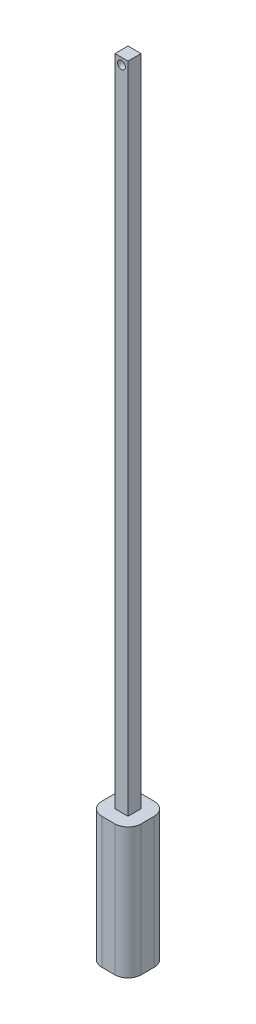
ISO-10303-21;
HEADER;
FILE_DESCRIPTION(('STEP AP214'),'2;1');
FILE_NAME('part.step','',(''),(''),'','','');
FILE_SCHEMA(('AUTOMOTIVE_DESIGN { 1 0 10303 214 1 1 1 1 }'));
ENDSEC;
DATA;
#1=APPLICATION_CONTEXT('core data for automotive mechanical design processes');
#2=APPLICATION_PROTOCOL_DEFINITION('international standard','automotive_design',2000,#1);
#3=PRODUCT_CONTEXT('',#1,'mechanical');
#4=PRODUCT('Part','Part','',(#3));
#5=PRODUCT_RELATED_PRODUCT_CATEGORY('part','',(#4));
#6=PRODUCT_DEFINITION_FORMATION('','',#4);
#7=PRODUCT_DEFINITION_CONTEXT('part definition',#1,'design');
#8=PRODUCT_DEFINITION('design','',#6,#7);
#9=PRODUCT_DEFINITION_SHAPE('','',#8);
#10=(LENGTH_UNIT() NAMED_UNIT(*) SI_UNIT(.MILLI.,.METRE.));
#11=(NAMED_UNIT(*) PLANE_ANGLE_UNIT() SI_UNIT($,.RADIAN.));
#12=(NAMED_UNIT(*) SI_UNIT($,.STERADIAN.) SOLID_ANGLE_UNIT());
#13=UNCERTAINTY_MEASURE_WITH_UNIT(LENGTH_MEASURE(1.E-05),#10,'distance_accuracy_value','');
#14=(GEOMETRIC_REPRESENTATION_CONTEXT(3) GLOBAL_UNCERTAINTY_ASSIGNED_CONTEXT((#13)) GLOBAL_UNIT_ASSIGNED_CONTEXT((#10,
#11,#12)) REPRESENTATION_CONTEXT('',''));
#15=CARTESIAN_POINT('',(0.,0.,0.));
#16=DIRECTION('',(0.,0.,1.));
#17=DIRECTION('',(1.,0.,0.));
#18=AXIS2_PLACEMENT_3D('',#15,#16,#17);
#19=CARTESIAN_POINT('',(0.,0.,10.));
#20=DIRECTION('',(0.,0.,1.));
#21=DIRECTION('',(1.,0.,0.));
#22=AXIS2_PLACEMENT_3D('',#19,#20,#21);
#23=PLANE('',#22);
#24=DIRECTION('',(0.,-1.,0.));
#25=VECTOR('',#24,1.);
#26=CARTESIAN_POINT('',(-5.,5.,10.));
#27=LINE('',#26,#25);
#28=CARTESIAN_POINT('',(-5.,5.,10.));
#29=VERTEX_POINT('',#28);
#30=CARTESIAN_POINT('',(-5.,-495.,10.));
#31=VERTEX_POINT('',#30);
#32=EDGE_CURVE('E142',#29,#31,#27,.T.);
#33=ORIENTED_EDGE('',*,*,#32,.T.);
#34=DIRECTION('',(1.,0.,0.));
#35=VECTOR('',#34,1.);
#36=CARTESIAN_POINT('',(-4.99999999999994,-495.,10.));
#37=LINE('',#36,#35);
#38=CARTESIAN_POINT('',(5.00000000000006,-495.,10.));
#39=VERTEX_POINT('',#38);
#40=EDGE_CURVE('E127',#31,#39,#37,.T.);
#41=ORIENTED_EDGE('',*,*,#40,.T.);
#42=DIRECTION('',(0.,1.,0.));
#43=VECTOR('',#42,1.);
#44=CARTESIAN_POINT('',(5.,5.,10.));
#45=LINE('',#44,#43);
#46=CARTESIAN_POINT('',(5.,5.,10.));
#47=VERTEX_POINT('',#46);
#48=EDGE_CURVE('E139',#39,#47,#45,.T.);
#49=ORIENTED_EDGE('',*,*,#48,.T.);
#50=DIRECTION('',(-1.,0.,0.));
#51=VECTOR('',#50,1.);
#52=CARTESIAN_POINT('',(-5.,5.,10.));
#53=LINE('',#52,#51);
#54=EDGE_CURVE('E148',#47,#29,#53,.T.);
#55=ORIENTED_EDGE('',*,*,#54,.T.);
#56=EDGE_LOOP('',(#33,#41,#49,#55));
#57=FACE_BOUND('',#56,.T.);
#58=CARTESIAN_POINT('',(0.,0.,10.));
#59=DIRECTION('',(0.,0.,1.));
#60=DIRECTION('',(1.,0.,0.));
#61=AXIS2_PLACEMENT_3D('',#58,#59,#60);
#62=CIRCLE('',#61,3.);
#63=CARTESIAN_POINT('',(3.,0.,10.));
#64=VERTEX_POINT('',#63);
#65=EDGE_CURVE('E157',#64,#64,#62,.T.);
#66=ORIENTED_EDGE('',*,*,#65,.F.);
#67=EDGE_LOOP('',(#66));
#68=FACE_BOUND('',#67,.T.);
#69=ADVANCED_FACE('F35',(#57,#68),#23,.T.);
#70=CARTESIAN_POINT('',(0.,0.,0.));
#71=DIRECTION('',(0.,0.,1.));
#72=DIRECTION('',(1.,0.,0.));
#73=AXIS2_PLACEMENT_3D('',#70,#71,#72);
#74=PLANE('',#73);
#75=DIRECTION('',(0.,-1.,0.));
#76=VECTOR('',#75,1.);
#77=CARTESIAN_POINT('',(-5.,5.,0.));
#78=LINE('',#77,#76);
#79=CARTESIAN_POINT('',(-5.,5.,0.));
#80=VERTEX_POINT('',#79);
#81=CARTESIAN_POINT('',(-5.,-495.,0.));
#82=VERTEX_POINT('',#81);
#83=EDGE_CURVE('E154',#80,#82,#78,.T.);
#84=ORIENTED_EDGE('',*,*,#83,.F.);
#85=DIRECTION('',(-1.,0.,0.));
#86=VECTOR('',#85,1.);
#87=CARTESIAN_POINT('',(-5.,5.,0.));
#88=LINE('',#87,#86);
#89=CARTESIAN_POINT('',(5.,5.,0.));
#90=VERTEX_POINT('',#89);
#91=EDGE_CURVE('E161',#90,#80,#88,.T.);
#92=ORIENTED_EDGE('',*,*,#91,.F.);
#93=DIRECTION('',(0.,1.,0.));
#94=VECTOR('',#93,1.);
#95=CARTESIAN_POINT('',(5.,5.,0.));
#96=LINE('',#95,#94);
#97=CARTESIAN_POINT('',(5.00000000000006,-495.,0.));
#98=VERTEX_POINT('',#97);
#99=EDGE_CURVE('E159',#98,#90,#96,.T.);
#100=ORIENTED_EDGE('',*,*,#99,.F.);
#101=DIRECTION('',(1.,0.,0.));
#102=VECTOR('',#101,1.);
#103=CARTESIAN_POINT('',(-4.99999999999994,-495.,0.));
#104=LINE('',#103,#102);
#105=EDGE_CURVE('E130',#82,#98,#104,.T.);
#106=ORIENTED_EDGE('',*,*,#105,.F.);
#107=EDGE_LOOP('',(#84,#92,#100,#106));
#108=FACE_BOUND('',#107,.T.);
#109=CARTESIAN_POINT('',(0.,0.,0.));
#110=DIRECTION('',(0.,0.,1.));
#111=DIRECTION('',(1.,0.,0.));
#112=AXIS2_PLACEMENT_3D('',#109,#110,#111);
#113=CIRCLE('',#112,3.);
#114=CARTESIAN_POINT('',(3.,0.,0.));
#115=VERTEX_POINT('',#114);
#116=EDGE_CURVE('E225',#115,#115,#113,.T.);
#117=ORIENTED_EDGE('',*,*,#116,.T.);
#118=EDGE_LOOP('',(#117));
#119=FACE_BOUND('',#118,.T.);
#120=ADVANCED_FACE('F265',(#108,#119),#74,.F.);
#121=CARTESIAN_POINT('',(-5.,5.,10.));
#122=DIRECTION('',(1.,0.,0.));
#123=DIRECTION('',(0.,1.,0.));
#124=AXIS2_PLACEMENT_3D('',#121,#122,#123);
#125=PLANE('',#124);
#126=ORIENTED_EDGE('',*,*,#83,.T.);
#127=DIRECTION('',(0.,0.,-1.));
#128=VECTOR('',#127,1.);
#129=CARTESIAN_POINT('',(-4.99999999999994,-495.,10.));
#130=LINE('',#129,#128);
#131=EDGE_CURVE('E134',#31,#82,#130,.T.);
#132=ORIENTED_EDGE('',*,*,#131,.F.);
#133=ORIENTED_EDGE('',*,*,#32,.F.);
#134=DIRECTION('',(0.,0.,-1.));
#135=VECTOR('',#134,1.);
#136=CARTESIAN_POINT('',(-5.,5.,10.));
#137=LINE('',#136,#135);
#138=EDGE_CURVE('E150',#29,#80,#137,.T.);
#139=ORIENTED_EDGE('',*,*,#138,.T.);
#140=EDGE_LOOP('',(#126,#132,#133,#139));
#141=FACE_BOUND('',#140,.T.);
#142=ADVANCED_FACE('F270',(#141),#125,.F.);
#143=CARTESIAN_POINT('',(5.,5.,10.));
#144=DIRECTION('',(-1.,0.,0.));
#145=DIRECTION('',(0.,-1.,0.));
#146=AXIS2_PLACEMENT_3D('',#143,#144,#145);
#147=PLANE('',#146);
#148=ORIENTED_EDGE('',*,*,#99,.T.);
#149=DIRECTION('',(0.,0.,-1.));
#150=VECTOR('',#149,1.);
#151=CARTESIAN_POINT('',(5.,5.,10.));
#152=LINE('',#151,#150);
#153=EDGE_CURVE('E135',#47,#90,#152,.T.);
#154=ORIENTED_EDGE('',*,*,#153,.F.);
#155=ORIENTED_EDGE('',*,*,#48,.F.);
#156=DIRECTION('',(0.,0.,-1.));
#157=VECTOR('',#156,1.);
#158=CARTESIAN_POINT('',(5.00000000000006,-495.,10.));
#159=LINE('',#158,#157);
#160=EDGE_CURVE('E124',#39,#98,#159,.T.);
#161=ORIENTED_EDGE('',*,*,#160,.T.);
#162=EDGE_LOOP('',(#148,#154,#155,#161));
#163=FACE_BOUND('',#162,.T.);
#164=ADVANCED_FACE('F145',(#163),#147,.F.);
#165=CARTESIAN_POINT('',(-5.,5.,10.));
#166=DIRECTION('',(0.,-1.,0.));
#167=DIRECTION('',(0.,0.,-1.));
#168=AXIS2_PLACEMENT_3D('',#165,#166,#167);
#169=PLANE('',#168);
#170=ORIENTED_EDGE('',*,*,#91,.T.);
#171=ORIENTED_EDGE('',*,*,#138,.F.);
#172=ORIENTED_EDGE('',*,*,#54,.F.);
#173=ORIENTED_EDGE('',*,*,#153,.T.);
#174=EDGE_LOOP('',(#170,#171,#172,#173));
#175=FACE_BOUND('',#174,.T.);
#176=ADVANCED_FACE('F277',(#175),#169,.F.);
#177=CARTESIAN_POINT('',(0.,0.,10.));
#178=DIRECTION('',(0.,0.,-1.));
#179=DIRECTION('',(-1.,0.,0.));
#180=AXIS2_PLACEMENT_3D('',#177,#178,#179);
#181=CYLINDRICAL_SURFACE('',#180,3.);
#182=ORIENTED_EDGE('',*,*,#65,.T.);
#183=EDGE_LOOP('',(#182));
#184=FACE_BOUND('',#183,.T.);
#185=ORIENTED_EDGE('',*,*,#116,.F.);
#186=EDGE_LOOP('',(#185));
#187=FACE_BOUND('',#186,.T.);
#188=ADVANCED_FACE('F274',(#184,#187),#181,.F.);
#189=CARTESIAN_POINT('',(0.,-495.,0.));
#190=DIRECTION('',(0.,-1.,0.));
#191=DIRECTION('',(0.,0.,-1.));
#192=AXIS2_PLACEMENT_3D('',#189,#190,#191);
#193=PLANE('',#192);
#194=DIRECTION('',(1.,0.,0.));
#195=VECTOR('',#194,1.);
#196=CARTESIAN_POINT('',(-14.9999999999999,-495.,-10.));
#197=LINE('',#196,#195);
#198=CARTESIAN_POINT('',(-4.99999999999994,-495.,-10.));
#199=VERTEX_POINT('',#198);
#200=CARTESIAN_POINT('',(5.00000000000006,-495.,-10.));
#201=VERTEX_POINT('',#200);
#202=EDGE_CURVE('E221',#199,#201,#197,.T.);
#203=ORIENTED_EDGE('',*,*,#202,.F.);
#204=CARTESIAN_POINT('',(-4.99999999999994,-495.,0.));
#205=DIRECTION('',(0.,-1.,0.));
#206=DIRECTION('',(0.,0.,-1.));
#207=AXIS2_PLACEMENT_3D('',#204,#205,#206);
#208=CIRCLE('',#207,10.);
#209=CARTESIAN_POINT('',(-14.9999999999999,-495.,0.));
#210=VERTEX_POINT('',#209);
#211=EDGE_CURVE('E178',#199,#210,#208,.F.);
#212=ORIENTED_EDGE('',*,*,#211,.T.);
#213=DIRECTION('',(0.,0.,-1.));
#214=VECTOR('',#213,1.);
#215=CARTESIAN_POINT('',(-14.9999999999999,-495.,20.));
#216=LINE('',#215,#214);
#217=CARTESIAN_POINT('',(-14.9999999999999,-495.,10.));
#218=VERTEX_POINT('',#217);
#219=EDGE_CURVE('E213',#218,#210,#216,.T.);
#220=ORIENTED_EDGE('',*,*,#219,.F.);
#221=CARTESIAN_POINT('',(-4.99999999999994,-495.,10.));
#222=DIRECTION('',(0.,-1.,0.));
#223=DIRECTION('',(0.,0.,-1.));
#224=AXIS2_PLACEMENT_3D('',#221,#222,#223);
#225=CIRCLE('',#224,10.);
#226=CARTESIAN_POINT('',(-4.99999999999994,-495.,20.));
#227=VERTEX_POINT('',#226);
#228=EDGE_CURVE('E172',#218,#227,#225,.F.);
#229=ORIENTED_EDGE('',*,*,#228,.T.);
#230=DIRECTION('',(-1.,0.,0.));
#231=VECTOR('',#230,1.);
#232=CARTESIAN_POINT('',(-14.9999999999999,-495.,20.));
#233=LINE('',#232,#231);
#234=CARTESIAN_POINT('',(5.00000000000006,-495.,20.));
#235=VERTEX_POINT('',#234);
#236=EDGE_CURVE('E211',#235,#227,#233,.T.);
#237=ORIENTED_EDGE('',*,*,#236,.F.);
#238=CARTESIAN_POINT('',(5.00000000000006,-495.,10.));
#239=DIRECTION('',(0.,-1.,0.));
#240=DIRECTION('',(0.,0.,-1.));
#241=AXIS2_PLACEMENT_3D('',#238,#239,#240);
#242=CIRCLE('',#241,10.);
#243=CARTESIAN_POINT('',(15.0000000000001,-495.,10.));
#244=VERTEX_POINT('',#243);
#245=EDGE_CURVE('E174',#235,#244,#242,.F.);
#246=ORIENTED_EDGE('',*,*,#245,.T.);
#247=DIRECTION('',(0.,0.,1.));
#248=VECTOR('',#247,1.);
#249=CARTESIAN_POINT('',(15.0000000000001,-495.,20.));
#250=LINE('',#249,#248);
#251=CARTESIAN_POINT('',(15.0000000000001,-495.,0.));
#252=VERTEX_POINT('',#251);
#253=EDGE_CURVE('E202',#252,#244,#250,.T.);
#254=ORIENTED_EDGE('',*,*,#253,.F.);
#255=CARTESIAN_POINT('',(5.00000000000006,-495.,0.));
#256=DIRECTION('',(0.,-1.,0.));
#257=DIRECTION('',(0.,0.,-1.));
#258=AXIS2_PLACEMENT_3D('',#255,#256,#257);
#259=CIRCLE('',#258,10.);
#260=EDGE_CURVE('E176',#252,#201,#259,.F.);
#261=ORIENTED_EDGE('',*,*,#260,.T.);
#262=EDGE_LOOP('',(#203,#212,#220,#229,#237,#246,#254,#261));
#263=FACE_BOUND('',#262,.T.);
#264=ORIENTED_EDGE('',*,*,#40,.F.);
#265=ORIENTED_EDGE('',*,*,#131,.T.);
#266=ORIENTED_EDGE('',*,*,#105,.T.);
#267=ORIENTED_EDGE('',*,*,#160,.F.);
#268=EDGE_LOOP('',(#264,#265,#266,#267));
#269=FACE_BOUND('',#268,.T.);
#270=ADVANCED_FACE('F126',(#263,#269),#193,.F.);
#271=CARTESIAN_POINT('',(15.0000000000001,-595.,20.));
#272=DIRECTION('',(-1.,0.,0.));
#273=DIRECTION('',(0.,0.,1.));
#274=AXIS2_PLACEMENT_3D('',#271,#272,#273);
#275=PLANE('',#274);
#276=DIRECTION('',(0.,0.,1.));
#277=VECTOR('',#276,1.);
#278=CARTESIAN_POINT('',(15.0000000000001,-595.,20.));
#279=LINE('',#278,#277);
#280=CARTESIAN_POINT('',(15.0000000000001,-595.,0.));
#281=VERTEX_POINT('',#280);
#282=CARTESIAN_POINT('',(15.0000000000001,-595.,10.));
#283=VERTEX_POINT('',#282);
#284=EDGE_CURVE('E204',#281,#283,#279,.T.);
#285=ORIENTED_EDGE('',*,*,#284,.F.);
#286=DIRECTION('',(0.,1.,0.));
#287=VECTOR('',#286,1.);
#288=CARTESIAN_POINT('',(15.0000000000001,-595.,0.));
#289=LINE('',#288,#287);
#290=EDGE_CURVE('E194',#281,#252,#289,.T.);
#291=ORIENTED_EDGE('',*,*,#290,.T.);
#292=ORIENTED_EDGE('',*,*,#253,.T.);
#293=DIRECTION('',(0.,1.,0.));
#294=VECTOR('',#293,1.);
#295=CARTESIAN_POINT('',(15.0000000000001,-595.,10.));
#296=LINE('',#295,#294);
#297=EDGE_CURVE('E192',#244,#283,#296,.F.);
#298=ORIENTED_EDGE('',*,*,#297,.T.);
#299=EDGE_LOOP('',(#285,#291,#292,#298));
#300=FACE_BOUND('',#299,.T.);
#301=ADVANCED_FACE('F201',(#300),#275,.F.);
#302=CARTESIAN_POINT('',(-14.9999999999999,-595.,20.));
#303=DIRECTION('',(0.,0.,-1.));
#304=DIRECTION('',(-1.,0.,0.));
#305=AXIS2_PLACEMENT_3D('',#302,#303,#304);
#306=PLANE('',#305);
#307=DIRECTION('',(-1.,0.,0.));
#308=VECTOR('',#307,1.);
#309=CARTESIAN_POINT('',(-14.9999999999999,-595.,20.));
#310=LINE('',#309,#308);
#311=CARTESIAN_POINT('',(5.00000000000006,-595.,20.));
#312=VERTEX_POINT('',#311);
#313=CARTESIAN_POINT('',(-4.99999999999994,-595.,20.));
#314=VERTEX_POINT('',#313);
#315=EDGE_CURVE('E233',#312,#314,#310,.T.);
#316=ORIENTED_EDGE('',*,*,#315,.F.);
#317=DIRECTION('',(0.,1.,0.));
#318=VECTOR('',#317,1.);
#319=CARTESIAN_POINT('',(5.00000000000006,-595.,20.));
#320=LINE('',#319,#318);
#321=EDGE_CURVE('E11',#312,#235,#320,.T.);
#322=ORIENTED_EDGE('',*,*,#321,.T.);
#323=ORIENTED_EDGE('',*,*,#236,.T.);
#324=DIRECTION('',(0.,1.,0.));
#325=VECTOR('',#324,1.);
#326=CARTESIAN_POINT('',(-4.99999999999994,-595.,20.));
#327=LINE('',#326,#325);
#328=EDGE_CURVE('E43',#227,#314,#327,.F.);
#329=ORIENTED_EDGE('',*,*,#328,.T.);
#330=EDGE_LOOP('',(#316,#322,#323,#329));
#331=FACE_BOUND('',#330,.T.);
#332=ADVANCED_FACE('F242',(#331),#306,.F.);
#333=CARTESIAN_POINT('',(-14.9999999999999,-595.,20.));
#334=DIRECTION('',(1.,0.,0.));
#335=DIRECTION('',(0.,0.,-1.));
#336=AXIS2_PLACEMENT_3D('',#333,#334,#335);
#337=PLANE('',#336);
#338=ORIENTED_EDGE('',*,*,#219,.T.);
#339=DIRECTION('',(0.,1.,0.));
#340=VECTOR('',#339,1.);
#341=CARTESIAN_POINT('',(-14.9999999999999,-595.,0.));
#342=LINE('',#341,#340);
#343=CARTESIAN_POINT('',(-14.9999999999999,-595.,0.));
#344=VERTEX_POINT('',#343);
#345=EDGE_CURVE('E183',#210,#344,#342,.F.);
#346=ORIENTED_EDGE('',*,*,#345,.T.);
#347=DIRECTION('',(0.,0.,-1.));
#348=VECTOR('',#347,1.);
#349=CARTESIAN_POINT('',(-14.9999999999999,-595.,20.));
#350=LINE('',#349,#348);
#351=CARTESIAN_POINT('',(-14.9999999999999,-595.,10.));
#352=VERTEX_POINT('',#351);
#353=EDGE_CURVE('E230',#352,#344,#350,.T.);
#354=ORIENTED_EDGE('',*,*,#353,.F.);
#355=DIRECTION('',(0.,1.,0.));
#356=VECTOR('',#355,1.);
#357=CARTESIAN_POINT('',(-14.9999999999999,-595.,10.));
#358=LINE('',#357,#356);
#359=EDGE_CURVE('E180',#352,#218,#358,.T.);
#360=ORIENTED_EDGE('',*,*,#359,.T.);
#361=EDGE_LOOP('',(#338,#346,#354,#360));
#362=FACE_BOUND('',#361,.T.);
#363=ADVANCED_FACE('F248',(#362),#337,.F.);
#364=CARTESIAN_POINT('',(-14.9999999999999,-595.,-10.));
#365=DIRECTION('',(0.,0.,1.));
#366=DIRECTION('',(1.,0.,0.));
#367=AXIS2_PLACEMENT_3D('',#364,#365,#366);
#368=PLANE('',#367);
#369=DIRECTION('',(1.,0.,0.));
#370=VECTOR('',#369,1.);
#371=CARTESIAN_POINT('',(-14.9999999999999,-595.,-10.));
#372=LINE('',#371,#370);
#373=CARTESIAN_POINT('',(-4.99999999999994,-595.,-10.));
#374=VERTEX_POINT('',#373);
#375=CARTESIAN_POINT('',(5.00000000000006,-595.,-10.));
#376=VERTEX_POINT('',#375);
#377=EDGE_CURVE('E216',#374,#376,#372,.T.);
#378=ORIENTED_EDGE('',*,*,#377,.F.);
#379=DIRECTION('',(0.,1.,0.));
#380=VECTOR('',#379,1.);
#381=CARTESIAN_POINT('',(-4.99999999999994,-595.,-10.));
#382=LINE('',#381,#380);
#383=EDGE_CURVE('E169',#374,#199,#382,.T.);
#384=ORIENTED_EDGE('',*,*,#383,.T.);
#385=ORIENTED_EDGE('',*,*,#202,.T.);
#386=DIRECTION('',(0.,1.,0.));
#387=VECTOR('',#386,1.);
#388=CARTESIAN_POINT('',(5.00000000000006,-595.,-10.));
#389=LINE('',#388,#387);
#390=EDGE_CURVE('E167',#201,#376,#389,.F.);
#391=ORIENTED_EDGE('',*,*,#390,.T.);
#392=EDGE_LOOP('',(#378,#384,#385,#391));
#393=FACE_BOUND('',#392,.T.);
#394=ADVANCED_FACE('F254',(#393),#368,.F.);
#395=CARTESIAN_POINT('',(0.,-595.,0.));
#396=DIRECTION('',(0.,-1.,0.));
#397=DIRECTION('',(0.,0.,-1.));
#398=AXIS2_PLACEMENT_3D('',#395,#396,#397);
#399=PLANE('',#398);
#400=ORIENTED_EDGE('',*,*,#353,.T.);
#401=CARTESIAN_POINT('',(-4.99999999999994,-595.,0.));
#402=DIRECTION('',(0.,-1.,0.));
#403=DIRECTION('',(0.,0.,-1.));
#404=AXIS2_PLACEMENT_3D('',#401,#402,#403);
#405=CIRCLE('',#404,10.);
#406=EDGE_CURVE('E190',#344,#374,#405,.T.);
#407=ORIENTED_EDGE('',*,*,#406,.T.);
#408=ORIENTED_EDGE('',*,*,#377,.T.);
#409=CARTESIAN_POINT('',(5.00000000000006,-595.,0.));
#410=DIRECTION('',(0.,-1.,0.));
#411=DIRECTION('',(0.,0.,-1.));
#412=AXIS2_PLACEMENT_3D('',#409,#410,#411);
#413=CIRCLE('',#412,10.);
#414=EDGE_CURVE('E188',#376,#281,#413,.T.);
#415=ORIENTED_EDGE('',*,*,#414,.T.);
#416=ORIENTED_EDGE('',*,*,#284,.T.);
#417=CARTESIAN_POINT('',(5.00000000000006,-595.,10.));
#418=DIRECTION('',(0.,-1.,0.));
#419=DIRECTION('',(0.,0.,-1.));
#420=AXIS2_PLACEMENT_3D('',#417,#418,#419);
#421=CIRCLE('',#420,10.);
#422=EDGE_CURVE('E56',#283,#312,#421,.T.);
#423=ORIENTED_EDGE('',*,*,#422,.T.);
#424=ORIENTED_EDGE('',*,*,#315,.T.);
#425=CARTESIAN_POINT('',(-4.99999999999994,-595.,10.));
#426=DIRECTION('',(0.,-1.,0.));
#427=DIRECTION('',(0.,0.,-1.));
#428=AXIS2_PLACEMENT_3D('',#425,#426,#427);
#429=CIRCLE('',#428,10.);
#430=EDGE_CURVE('E185',#314,#352,#429,.T.);
#431=ORIENTED_EDGE('',*,*,#430,.T.);
#432=EDGE_LOOP('',(#400,#407,#408,#415,#416,#423,#424,#431));
#433=FACE_BOUND('',#432,.T.);
#434=ADVANCED_FACE('F238',(#433),#399,.T.);
#435=CARTESIAN_POINT('',(-4.99999999999994,-595.,0.));
#436=DIRECTION('',(0.,1.,0.));
#437=DIRECTION('',(0.,0.,1.));
#438=AXIS2_PLACEMENT_3D('',#435,#436,#437);
#439=CYLINDRICAL_SURFACE('',#438,10.);
#440=ORIENTED_EDGE('',*,*,#406,.F.);
#441=ORIENTED_EDGE('',*,*,#345,.F.);
#442=ORIENTED_EDGE('',*,*,#211,.F.);
#443=ORIENTED_EDGE('',*,*,#383,.F.);
#444=EDGE_LOOP('',(#440,#441,#442,#443));
#445=FACE_BOUND('',#444,.T.);
#446=ADVANCED_FACE('F251',(#445),#439,.T.);
#447=CARTESIAN_POINT('',(5.00000000000006,-595.,0.));
#448=DIRECTION('',(0.,1.,0.));
#449=DIRECTION('',(0.,0.,1.));
#450=AXIS2_PLACEMENT_3D('',#447,#448,#449);
#451=CYLINDRICAL_SURFACE('',#450,10.);
#452=ORIENTED_EDGE('',*,*,#414,.F.);
#453=ORIENTED_EDGE('',*,*,#390,.F.);
#454=ORIENTED_EDGE('',*,*,#260,.F.);
#455=ORIENTED_EDGE('',*,*,#290,.F.);
#456=EDGE_LOOP('',(#452,#453,#454,#455));
#457=FACE_BOUND('',#456,.T.);
#458=ADVANCED_FACE('F256',(#457),#451,.T.);
#459=CARTESIAN_POINT('',(5.00000000000006,-595.,10.));
#460=DIRECTION('',(0.,1.,0.));
#461=DIRECTION('',(0.,0.,1.));
#462=AXIS2_PLACEMENT_3D('',#459,#460,#461);
#463=CYLINDRICAL_SURFACE('',#462,10.);
#464=ORIENTED_EDGE('',*,*,#422,.F.);
#465=ORIENTED_EDGE('',*,*,#297,.F.);
#466=ORIENTED_EDGE('',*,*,#245,.F.);
#467=ORIENTED_EDGE('',*,*,#321,.F.);
#468=EDGE_LOOP('',(#464,#465,#466,#467));
#469=FACE_BOUND('',#468,.T.);
#470=ADVANCED_FACE('F241',(#469),#463,.T.);
#471=CARTESIAN_POINT('',(-4.99999999999994,-595.,10.));
#472=DIRECTION('',(0.,1.,0.));
#473=DIRECTION('',(0.,0.,1.));
#474=AXIS2_PLACEMENT_3D('',#471,#472,#473);
#475=CYLINDRICAL_SURFACE('',#474,10.);
#476=ORIENTED_EDGE('',*,*,#430,.F.);
#477=ORIENTED_EDGE('',*,*,#328,.F.);
#478=ORIENTED_EDGE('',*,*,#228,.F.);
#479=ORIENTED_EDGE('',*,*,#359,.F.);
#480=EDGE_LOOP('',(#476,#477,#478,#479));
#481=FACE_BOUND('',#480,.T.);
#482=ADVANCED_FACE('F37',(#481),#475,.T.);
#483=CLOSED_SHELL('',(#69,#120,#142,#164,#176,#188,#270,#301,#332,#363,#394,#434,#446,#458,#470,#482));
#484=MANIFOLD_SOLID_BREP('B2',#483);
#485=ADVANCED_BREP_SHAPE_REPRESENTATION('',(#18,#484),#14);
#486=SHAPE_DEFINITION_REPRESENTATION(#9,#485);
ENDSEC;
END-ISO-10303-21;
